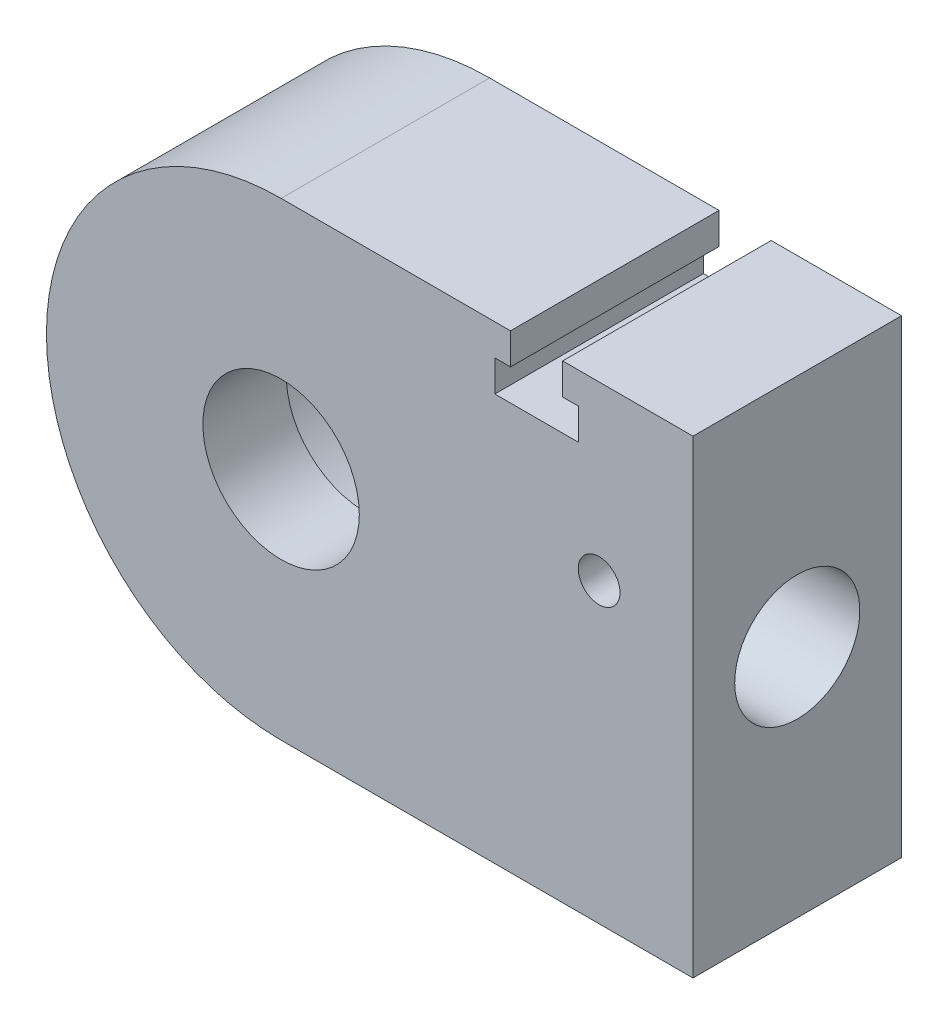
ISO-10303-21;
HEADER;
FILE_DESCRIPTION(('STEP AP214'),'2;1');
FILE_NAME('part.step','',(''),(''),'','','');
FILE_SCHEMA(('AUTOMOTIVE_DESIGN { 1 0 10303 214 1 1 1 1 }'));
ENDSEC;
DATA;
#1=APPLICATION_CONTEXT('core data for automotive mechanical design processes');
#2=APPLICATION_PROTOCOL_DEFINITION('international standard','automotive_design',2000,#1);
#3=PRODUCT_CONTEXT('',#1,'mechanical');
#4=PRODUCT('Part','Part','',(#3));
#5=PRODUCT_RELATED_PRODUCT_CATEGORY('part','',(#4));
#6=PRODUCT_DEFINITION_FORMATION('','',#4);
#7=PRODUCT_DEFINITION_CONTEXT('part definition',#1,'design');
#8=PRODUCT_DEFINITION('design','',#6,#7);
#9=PRODUCT_DEFINITION_SHAPE('','',#8);
#10=(LENGTH_UNIT() NAMED_UNIT(*) SI_UNIT(.MILLI.,.METRE.));
#11=(NAMED_UNIT(*) PLANE_ANGLE_UNIT() SI_UNIT($,.RADIAN.));
#12=(NAMED_UNIT(*) SI_UNIT($,.STERADIAN.) SOLID_ANGLE_UNIT());
#13=UNCERTAINTY_MEASURE_WITH_UNIT(LENGTH_MEASURE(1.E-05),#10,'distance_accuracy_value','');
#14=(GEOMETRIC_REPRESENTATION_CONTEXT(3) GLOBAL_UNCERTAINTY_ASSIGNED_CONTEXT((#13)) GLOBAL_UNIT_ASSIGNED_CONTEXT((#10,
#11,#12)) REPRESENTATION_CONTEXT('',''));
#15=CARTESIAN_POINT('',(0.,0.,0.));
#16=DIRECTION('',(0.,0.,1.));
#17=DIRECTION('',(1.,0.,0.));
#18=AXIS2_PLACEMENT_3D('',#15,#16,#17);
#19=CARTESIAN_POINT('',(-634.508066615171,-2.49999999999969,10.));
#20=DIRECTION('',(0.,0.,1.));
#21=DIRECTION('',(1.,0.,0.));
#22=AXIS2_PLACEMENT_3D('',#19,#20,#21);
#23=PLANE('',#22);
#24=CARTESIAN_POINT('',(-604.008671928237,3.50000000000032,10.));
#25=DIRECTION('',(0.,0.,1.));
#26=DIRECTION('',(1.,0.,0.));
#27=AXIS2_PLACEMENT_3D('',#24,#25,#26);
#28=CIRCLE('',#27,2.);
#29=CARTESIAN_POINT('',(-602.008671928237,3.50000000000032,10.));
#30=VERTEX_POINT('',#29);
#31=EDGE_CURVE('E247',#30,#30,#28,.T.);
#32=ORIENTED_EDGE('',*,*,#31,.F.);
#33=EDGE_LOOP('',(#32));
#34=FACE_BOUND('',#33,.T.);
#35=CARTESIAN_POINT('',(-634.508066615171,-2.49999999999969,10.));
#36=DIRECTION('',(0.,0.,1.));
#37=DIRECTION('',(1.,0.,0.));
#38=AXIS2_PLACEMENT_3D('',#35,#36,#37);
#39=CIRCLE('',#38,7.49999999999996);
#40=CARTESIAN_POINT('',(-627.008066615171,-2.49999999999969,10.));
#41=VERTEX_POINT('',#40);
#42=EDGE_CURVE('E184',#41,#41,#39,.T.);
#43=ORIENTED_EDGE('',*,*,#42,.F.);
#44=EDGE_LOOP('',(#43));
#45=FACE_BOUND('',#44,.T.);
#46=DIRECTION('',(1.,0.,0.));
#47=VECTOR('',#46,1.);
#48=CARTESIAN_POINT('',(-634.508066615171,19.9999999999999,10.));
#49=LINE('',#48,#47);
#50=CARTESIAN_POINT('',(-607.508671928237,19.9999999999999,10.));
#51=VERTEX_POINT('',#50);
#52=CARTESIAN_POINT('',(-595.008671928237,19.9999999999999,10.));
#53=VERTEX_POINT('',#52);
#54=EDGE_CURVE('E109',#51,#53,#49,.T.);
#55=ORIENTED_EDGE('',*,*,#54,.F.);
#56=DIRECTION('',(0.,-1.,0.));
#57=VECTOR('',#56,1.);
#58=CARTESIAN_POINT('',(-607.508671928237,0.,10.));
#59=LINE('',#58,#57);
#60=CARTESIAN_POINT('',(-607.508671928237,16.9999999999999,10.));
#61=VERTEX_POINT('',#60);
#62=EDGE_CURVE('E156',#51,#61,#59,.T.);
#63=ORIENTED_EDGE('',*,*,#62,.T.);
#64=DIRECTION('',(1.,0.,0.));
#65=VECTOR('',#64,1.);
#66=CARTESIAN_POINT('',(0.,16.9999999999999,10.));
#67=LINE('',#66,#65);
#68=CARTESIAN_POINT('',(-606.008671928237,16.9999999999999,10.));
#69=VERTEX_POINT('',#68);
#70=EDGE_CURVE('E524',#61,#69,#67,.T.);
#71=ORIENTED_EDGE('',*,*,#70,.T.);
#72=DIRECTION('',(0.,-1.,0.));
#73=VECTOR('',#72,1.);
#74=CARTESIAN_POINT('',(-606.008671928237,0.,10.));
#75=LINE('',#74,#73);
#76=CARTESIAN_POINT('',(-606.008671928237,13.9999999999999,10.));
#77=VERTEX_POINT('',#76);
#78=EDGE_CURVE('E551',#69,#77,#75,.T.);
#79=ORIENTED_EDGE('',*,*,#78,.T.);
#80=DIRECTION('',(1.,0.,0.));
#81=VECTOR('',#80,1.);
#82=CARTESIAN_POINT('',(0.,13.9999999999999,10.));
#83=LINE('',#82,#81);
#84=CARTESIAN_POINT('',(-614.008671928237,13.9999999999999,10.));
#85=VERTEX_POINT('',#84);
#86=EDGE_CURVE('E549',#85,#77,#83,.T.);
#87=ORIENTED_EDGE('',*,*,#86,.F.);
#88=DIRECTION('',(0.,-1.,0.));
#89=VECTOR('',#88,1.);
#90=CARTESIAN_POINT('',(-614.008671928237,0.,10.));
#91=LINE('',#90,#89);
#92=CARTESIAN_POINT('',(-614.008671928237,16.9999999999999,10.));
#93=VERTEX_POINT('',#92);
#94=EDGE_CURVE('E543',#93,#85,#91,.T.);
#95=ORIENTED_EDGE('',*,*,#94,.F.);
#96=DIRECTION('',(-1.,0.,0.));
#97=VECTOR('',#96,1.);
#98=CARTESIAN_POINT('',(0.,16.9999999999999,10.));
#99=LINE('',#98,#97);
#100=CARTESIAN_POINT('',(-612.508671928237,16.9999999999999,10.));
#101=VERTEX_POINT('',#100);
#102=EDGE_CURVE('E545',#101,#93,#99,.T.);
#103=ORIENTED_EDGE('',*,*,#102,.F.);
#104=DIRECTION('',(0.,-1.,0.));
#105=VECTOR('',#104,1.);
#106=CARTESIAN_POINT('',(-612.508671928237,0.,10.));
#107=LINE('',#106,#105);
#108=CARTESIAN_POINT('',(-612.508671928237,19.9999999999999,10.));
#109=VERTEX_POINT('',#108);
#110=EDGE_CURVE('E165',#109,#101,#107,.T.);
#111=ORIENTED_EDGE('',*,*,#110,.F.);
#112=CARTESIAN_POINT('',(-634.508066615171,19.9999999999999,10.));
#113=VERTEX_POINT('',#112);
#114=EDGE_CURVE('E177',#113,#109,#49,.T.);
#115=ORIENTED_EDGE('',*,*,#114,.F.);
#116=CARTESIAN_POINT('',(-634.508066615171,-2.49999999999969,10.));
#117=DIRECTION('',(0.,0.,1.));
#118=DIRECTION('',(1.,0.,0.));
#119=AXIS2_PLACEMENT_3D('',#116,#117,#118);
#120=CIRCLE('',#119,22.4999999999996);
#121=CARTESIAN_POINT('',(-634.508066615171,-24.9999999999993,10.));
#122=VERTEX_POINT('',#121);
#123=EDGE_CURVE('E190',#113,#122,#120,.T.);
#124=ORIENTED_EDGE('',*,*,#123,.T.);
#125=DIRECTION('',(-1.,0.,0.));
#126=VECTOR('',#125,1.);
#127=CARTESIAN_POINT('',(-595.008671928237,-24.9999999999993,10.));
#128=LINE('',#127,#126);
#129=CARTESIAN_POINT('',(-595.008671928237,-24.9999999999993,10.));
#130=VERTEX_POINT('',#129);
#131=EDGE_CURVE('E187',#130,#122,#128,.T.);
#132=ORIENTED_EDGE('',*,*,#131,.F.);
#133=DIRECTION('',(0.,-1.,0.));
#134=VECTOR('',#133,1.);
#135=CARTESIAN_POINT('',(-595.008671928237,19.9999999999999,10.));
#136=LINE('',#135,#134);
#137=EDGE_CURVE('E176',#53,#130,#136,.T.);
#138=ORIENTED_EDGE('',*,*,#137,.F.);
#139=EDGE_LOOP('',(#55,#63,#71,#79,#87,#95,#103,#111,#115,#124,#132,#138));
#140=FACE_BOUND('',#139,.T.);
#141=ADVANCED_FACE('F53',(#34,#45,#140),#23,.T.);
#142=CARTESIAN_POINT('',(-634.508066615171,-2.49999999999969,-10.));
#143=DIRECTION('',(0.,0.,1.));
#144=DIRECTION('',(1.,0.,0.));
#145=AXIS2_PLACEMENT_3D('',#142,#143,#144);
#146=PLANE('',#145);
#147=CARTESIAN_POINT('',(-634.508066615171,-2.49999999999969,-10.));
#148=DIRECTION('',(0.,0.,1.));
#149=DIRECTION('',(1.,0.,0.));
#150=AXIS2_PLACEMENT_3D('',#147,#148,#149);
#151=CIRCLE('',#150,14.);
#152=CARTESIAN_POINT('',(-620.508066615171,-2.49999999999969,-10.));
#153=VERTEX_POINT('',#152);
#154=EDGE_CURVE('E214',#153,#153,#151,.T.);
#155=ORIENTED_EDGE('',*,*,#154,.T.);
#156=EDGE_LOOP('',(#155));
#157=FACE_BOUND('',#156,.T.);
#158=CARTESIAN_POINT('',(-604.008671928237,3.50000000000032,-10.));
#159=DIRECTION('',(0.,0.,1.));
#160=DIRECTION('',(1.,0.,0.));
#161=AXIS2_PLACEMENT_3D('',#158,#159,#160);
#162=CIRCLE('',#161,2.);
#163=CARTESIAN_POINT('',(-602.008671928237,3.50000000000032,-10.));
#164=VERTEX_POINT('',#163);
#165=EDGE_CURVE('E249',#164,#164,#162,.T.);
#166=ORIENTED_EDGE('',*,*,#165,.T.);
#167=EDGE_LOOP('',(#166));
#168=FACE_BOUND('',#167,.T.);
#169=DIRECTION('',(0.,-1.,0.));
#170=VECTOR('',#169,1.);
#171=CARTESIAN_POINT('',(-607.508671928237,0.,-10.));
#172=LINE('',#171,#170);
#173=CARTESIAN_POINT('',(-607.508671928237,19.9999999999999,-10.));
#174=VERTEX_POINT('',#173);
#175=CARTESIAN_POINT('',(-607.508671928237,16.9999999999999,-10.));
#176=VERTEX_POINT('',#175);
#177=EDGE_CURVE('E231',#174,#176,#172,.T.);
#178=ORIENTED_EDGE('',*,*,#177,.F.);
#179=DIRECTION('',(1.,0.,0.));
#180=VECTOR('',#179,1.);
#181=CARTESIAN_POINT('',(-634.508066615171,19.9999999999999,-10.));
#182=LINE('',#181,#180);
#183=CARTESIAN_POINT('',(-595.008671928237,19.9999999999999,-10.));
#184=VERTEX_POINT('',#183);
#185=EDGE_CURVE('E169',#174,#184,#182,.T.);
#186=ORIENTED_EDGE('',*,*,#185,.T.);
#187=DIRECTION('',(0.,-1.,0.));
#188=VECTOR('',#187,1.);
#189=CARTESIAN_POINT('',(-595.008671928237,19.9999999999999,-10.));
#190=LINE('',#189,#188);
#191=CARTESIAN_POINT('',(-595.008671928237,-24.9999999999993,-10.));
#192=VERTEX_POINT('',#191);
#193=EDGE_CURVE('E196',#184,#192,#190,.T.);
#194=ORIENTED_EDGE('',*,*,#193,.T.);
#195=DIRECTION('',(-1.,0.,0.));
#196=VECTOR('',#195,1.);
#197=CARTESIAN_POINT('',(-595.008671928237,-24.9999999999993,-10.));
#198=LINE('',#197,#196);
#199=CARTESIAN_POINT('',(-634.508066615171,-24.9999999999993,-10.));
#200=VERTEX_POINT('',#199);
#201=EDGE_CURVE('E180',#192,#200,#198,.T.);
#202=ORIENTED_EDGE('',*,*,#201,.T.);
#203=CARTESIAN_POINT('',(-634.508066615171,-2.49999999999969,-10.));
#204=DIRECTION('',(0.,0.,1.));
#205=DIRECTION('',(1.,0.,0.));
#206=AXIS2_PLACEMENT_3D('',#203,#204,#205);
#207=CIRCLE('',#206,22.4999999999996);
#208=CARTESIAN_POINT('',(-634.508066615171,19.9999999999999,-10.));
#209=VERTEX_POINT('',#208);
#210=EDGE_CURVE('E178',#209,#200,#207,.T.);
#211=ORIENTED_EDGE('',*,*,#210,.F.);
#212=CARTESIAN_POINT('',(-612.508671928237,19.9999999999999,-10.));
#213=VERTEX_POINT('',#212);
#214=EDGE_CURVE('E193',#209,#213,#182,.T.);
#215=ORIENTED_EDGE('',*,*,#214,.T.);
#216=DIRECTION('',(0.,-1.,0.));
#217=VECTOR('',#216,1.);
#218=CARTESIAN_POINT('',(-612.508671928237,0.,-10.));
#219=LINE('',#218,#217);
#220=CARTESIAN_POINT('',(-612.508671928237,16.9999999999999,-10.));
#221=VERTEX_POINT('',#220);
#222=EDGE_CURVE('E75',#213,#221,#219,.T.);
#223=ORIENTED_EDGE('',*,*,#222,.T.);
#224=DIRECTION('',(-1.,0.,0.));
#225=VECTOR('',#224,1.);
#226=CARTESIAN_POINT('',(0.,16.9999999999999,-10.));
#227=LINE('',#226,#225);
#228=CARTESIAN_POINT('',(-614.008671928237,16.9999999999999,-10.));
#229=VERTEX_POINT('',#228);
#230=EDGE_CURVE('E518',#221,#229,#227,.T.);
#231=ORIENTED_EDGE('',*,*,#230,.T.);
#232=DIRECTION('',(0.,-1.,0.));
#233=VECTOR('',#232,1.);
#234=CARTESIAN_POINT('',(-614.008671928237,0.,-10.));
#235=LINE('',#234,#233);
#236=CARTESIAN_POINT('',(-614.008671928237,13.9999999999999,-10.));
#237=VERTEX_POINT('',#236);
#238=EDGE_CURVE('E521',#229,#237,#235,.T.);
#239=ORIENTED_EDGE('',*,*,#238,.T.);
#240=DIRECTION('',(1.,0.,0.));
#241=VECTOR('',#240,1.);
#242=CARTESIAN_POINT('',(0.,13.9999999999999,-10.));
#243=LINE('',#242,#241);
#244=CARTESIAN_POINT('',(-606.008671928237,13.9999999999999,-10.));
#245=VERTEX_POINT('',#244);
#246=EDGE_CURVE('E529',#237,#245,#243,.T.);
#247=ORIENTED_EDGE('',*,*,#246,.T.);
#248=DIRECTION('',(0.,-1.,0.));
#249=VECTOR('',#248,1.);
#250=CARTESIAN_POINT('',(-606.008671928237,0.,-10.));
#251=LINE('',#250,#249);
#252=CARTESIAN_POINT('',(-606.008671928237,16.9999999999999,-10.));
#253=VERTEX_POINT('',#252);
#254=EDGE_CURVE('E532',#253,#245,#251,.T.);
#255=ORIENTED_EDGE('',*,*,#254,.F.);
#256=DIRECTION('',(1.,0.,0.));
#257=VECTOR('',#256,1.);
#258=CARTESIAN_POINT('',(0.,16.9999999999999,-10.));
#259=LINE('',#258,#257);
#260=EDGE_CURVE('E171',#176,#253,#259,.T.);
#261=ORIENTED_EDGE('',*,*,#260,.F.);
#262=EDGE_LOOP('',(#178,#186,#194,#202,#211,#215,#223,#231,#239,#247,#255,#261));
#263=FACE_BOUND('',#262,.T.);
#264=ADVANCED_FACE('F228',(#157,#168,#263),#146,.F.);
#265=CARTESIAN_POINT('',(-634.508066615171,19.9999999999999,10.));
#266=DIRECTION('',(0.,1.,0.));
#267=DIRECTION('',(0.,0.,1.));
#268=AXIS2_PLACEMENT_3D('',#265,#266,#267);
#269=PLANE('',#268);
#270=ORIENTED_EDGE('',*,*,#185,.F.);
#271=DIRECTION('',(0.,0.,1.));
#272=VECTOR('',#271,1.);
#273=CARTESIAN_POINT('',(-607.508671928237,19.9999999999999,-10.));
#274=LINE('',#273,#272);
#275=EDGE_CURVE('E158',#174,#51,#274,.T.);
#276=ORIENTED_EDGE('',*,*,#275,.T.);
#277=ORIENTED_EDGE('',*,*,#54,.T.);
#278=DIRECTION('',(0.,0.,-1.));
#279=VECTOR('',#278,1.);
#280=CARTESIAN_POINT('',(-595.008671928237,19.9999999999999,10.));
#281=LINE('',#280,#279);
#282=EDGE_CURVE('E192',#53,#184,#281,.T.);
#283=ORIENTED_EDGE('',*,*,#282,.T.);
#284=EDGE_LOOP('',(#270,#276,#277,#283));
#285=FACE_BOUND('',#284,.T.);
#286=ADVANCED_FACE('F168',(#285),#269,.T.);
#287=DIRECTION('',(0.,0.,1.));
#288=VECTOR('',#287,1.);
#289=CARTESIAN_POINT('',(-612.508671928237,19.9999999999999,-10.));
#290=LINE('',#289,#288);
#291=EDGE_CURVE('E170',#213,#109,#290,.T.);
#292=ORIENTED_EDGE('',*,*,#291,.F.);
#293=ORIENTED_EDGE('',*,*,#214,.F.);
#294=DIRECTION('',(0.,0.,-1.));
#295=VECTOR('',#294,1.);
#296=CARTESIAN_POINT('',(-634.508066615171,19.9999999999999,10.));
#297=LINE('',#296,#295);
#298=EDGE_CURVE('E12',#113,#209,#297,.T.);
#299=ORIENTED_EDGE('',*,*,#298,.F.);
#300=ORIENTED_EDGE('',*,*,#114,.T.);
#301=EDGE_LOOP('',(#292,#293,#299,#300));
#302=FACE_BOUND('',#301,.T.);
#303=ADVANCED_FACE('F55',(#302),#269,.T.);
#304=CARTESIAN_POINT('',(-634.508066615171,-2.49999999999969,10.));
#305=DIRECTION('',(0.,0.,-1.));
#306=DIRECTION('',(-1.,0.,0.));
#307=AXIS2_PLACEMENT_3D('',#304,#305,#306);
#308=CYLINDRICAL_SURFACE('',#307,22.4999999999996);
#309=ORIENTED_EDGE('',*,*,#210,.T.);
#310=DIRECTION('',(0.,0.,-1.));
#311=VECTOR('',#310,1.);
#312=CARTESIAN_POINT('',(-634.508066615171,-24.9999999999993,10.));
#313=LINE('',#312,#311);
#314=EDGE_CURVE('E67',#122,#200,#313,.T.);
#315=ORIENTED_EDGE('',*,*,#314,.F.);
#316=ORIENTED_EDGE('',*,*,#123,.F.);
#317=ORIENTED_EDGE('',*,*,#298,.T.);
#318=EDGE_LOOP('',(#309,#315,#316,#317));
#319=FACE_BOUND('',#318,.T.);
#320=ADVANCED_FACE('F274',(#319),#308,.T.);
#321=CARTESIAN_POINT('',(-595.008671928237,-24.9999999999993,10.));
#322=DIRECTION('',(0.,-1.,0.));
#323=DIRECTION('',(1.,0.,0.));
#324=AXIS2_PLACEMENT_3D('',#321,#322,#323);
#325=PLANE('',#324);
#326=ORIENTED_EDGE('',*,*,#201,.F.);
#327=DIRECTION('',(0.,0.,-1.));
#328=VECTOR('',#327,1.);
#329=CARTESIAN_POINT('',(-595.008671928237,-24.9999999999993,10.));
#330=LINE('',#329,#328);
#331=EDGE_CURVE('E202',#130,#192,#330,.T.);
#332=ORIENTED_EDGE('',*,*,#331,.F.);
#333=ORIENTED_EDGE('',*,*,#131,.T.);
#334=ORIENTED_EDGE('',*,*,#314,.T.);
#335=EDGE_LOOP('',(#326,#332,#333,#334));
#336=FACE_BOUND('',#335,.T.);
#337=ADVANCED_FACE('F236',(#336),#325,.T.);
#338=CARTESIAN_POINT('',(-595.008671928237,19.9999999999999,10.));
#339=DIRECTION('',(1.,0.,0.));
#340=DIRECTION('',(0.,0.,-1.));
#341=AXIS2_PLACEMENT_3D('',#338,#339,#340);
#342=PLANE('',#341);
#343=CARTESIAN_POINT('',(-595.008671928237,-2.49999999999969,0.));
#344=DIRECTION('',(-1.,0.,0.));
#345=DIRECTION('',(0.,0.,1.));
#346=AXIS2_PLACEMENT_3D('',#343,#344,#345);
#347=CIRCLE('',#346,6.00000000000001);
#348=CARTESIAN_POINT('',(-595.008671928237,-2.49999999999969,6.00000000000001));
#349=VERTEX_POINT('',#348);
#350=EDGE_CURVE('E206',#349,#349,#347,.T.);
#351=ORIENTED_EDGE('',*,*,#350,.T.);
#352=EDGE_LOOP('',(#351));
#353=FACE_BOUND('',#352,.T.);
#354=ORIENTED_EDGE('',*,*,#193,.F.);
#355=ORIENTED_EDGE('',*,*,#282,.F.);
#356=ORIENTED_EDGE('',*,*,#137,.T.);
#357=ORIENTED_EDGE('',*,*,#331,.T.);
#358=EDGE_LOOP('',(#354,#355,#356,#357));
#359=FACE_BOUND('',#358,.T.);
#360=ADVANCED_FACE('F233',(#353,#359),#342,.T.);
#361=CARTESIAN_POINT('',(-634.508066615171,-2.49999999999969,10.));
#362=DIRECTION('',(0.,0.,-1.));
#363=DIRECTION('',(-1.,0.,0.));
#364=AXIS2_PLACEMENT_3D('',#361,#362,#363);
#365=CYLINDRICAL_SURFACE('',#364,7.49999999999996);
#366=CARTESIAN_POINT('',(-634.508066615171,-2.49999999999969,2.));
#367=DIRECTION('',(0.,0.,1.));
#368=DIRECTION('',(1.,0.,0.));
#369=AXIS2_PLACEMENT_3D('',#366,#367,#368);
#370=CIRCLE('',#369,7.49999999999996);
#371=CARTESIAN_POINT('',(-627.008066615171,-2.49999999999969,2.));
#372=VERTEX_POINT('',#371);
#373=EDGE_CURVE('E204',#372,#372,#370,.T.);
#374=ORIENTED_EDGE('',*,*,#373,.F.);
#375=EDGE_LOOP('',(#374));
#376=FACE_BOUND('',#375,.T.);
#377=ORIENTED_EDGE('',*,*,#42,.T.);
#378=EDGE_LOOP('',(#377));
#379=FACE_BOUND('',#378,.T.);
#380=ADVANCED_FACE('F267',(#376,#379),#365,.F.);
#381=CARTESIAN_POINT('',(-612.008671928237,-2.49999999999969,0.));
#382=DIRECTION('',(-1.,0.,0.));
#383=DIRECTION('',(0.,0.,1.));
#384=AXIS2_PLACEMENT_3D('',#381,#382,#383);
#385=PLANE('',#384);
#386=CARTESIAN_POINT('',(-612.008671928237,-2.49999999999969,0.));
#387=DIRECTION('',(-1.,0.,0.));
#388=DIRECTION('',(0.,0.,1.));
#389=AXIS2_PLACEMENT_3D('',#386,#387,#388);
#390=CIRCLE('',#389,6.00000000000001);
#391=CARTESIAN_POINT('',(-612.008671928237,-2.49999999999969,6.00000000000001));
#392=VERTEX_POINT('',#391);
#393=EDGE_CURVE('E211',#392,#392,#390,.T.);
#394=ORIENTED_EDGE('',*,*,#393,.F.);
#395=EDGE_LOOP('',(#394));
#396=FACE_BOUND('',#395,.T.);
#397=ADVANCED_FACE('F262',(#396),#385,.F.);
#398=CARTESIAN_POINT('',(-666.113025571018,-2.49999999999969,0.));
#399=DIRECTION('',(-1.,0.,0.));
#400=DIRECTION('',(0.,0.,1.));
#401=AXIS2_PLACEMENT_3D('',#398,#399,#400);
#402=CYLINDRICAL_SURFACE('',#401,6.00000000000001);
#403=CARTESIAN_POINT('',(-602.008671928237,3.50000000000032,0.));
#404=CARTESIAN_POINT('',(-602.008674236148,3.50000034205196,0.168404625428711));
#405=CARTESIAN_POINT('',(-602.008634884061,3.49290641783626,0.336801575679913));
#406=CARTESIAN_POINT('',(-602.008934966189,3.46457415462165,0.672484489536321));
#407=CARTESIAN_POINT('',(-602.009274572881,3.44332937683819,0.83976991237384));
#408=CARTESIAN_POINT('',(-602.011677423404,3.38681157645678,1.17213591901359));
#409=CARTESIAN_POINT('',(-602.013742628198,3.35152261800779,1.33721377721103));
#410=CARTESIAN_POINT('',(-602.021814532794,3.26719702898689,1.66367838894613));
#411=CARTESIAN_POINT('',(-602.027819235826,3.21816737022652,1.82506696956701));
#412=CARTESIAN_POINT('',(-602.043491278391,3.12666990439746,2.086229448696));
#413=CARTESIAN_POINT('',(-602.051095513519,3.08807345216627,2.1874965512854));
#414=CARTESIAN_POINT('',(-602.070278185055,3.00560622509883,2.3874647843065));
#415=CARTESIAN_POINT('',(-602.081855597946,2.96173681049957,2.48616656854282));
#416=CARTESIAN_POINT('',(-602.110159132702,2.86913655005333,2.6802811784473));
#417=CARTESIAN_POINT('',(-602.12687485363,2.82041565801858,2.77570021908406));
#418=CARTESIAN_POINT('',(-602.166830902239,2.7185849237655,2.96272001071977));
#419=CARTESIAN_POINT('',(-602.190068567439,2.66547687876325,3.05432230235765));
#420=CARTESIAN_POINT('',(-602.254082752954,2.53653574067951,3.26392373056456));
#421=CARTESIAN_POINT('',(-602.298147268396,2.45921210733965,3.38005187229782));
#422=CARTESIAN_POINT('',(-602.404956617582,2.30118669948619,3.60096634426211));
#423=CARTESIAN_POINT('',(-602.467676910383,2.22048948191002,3.70576732951828));
#424=CARTESIAN_POINT('',(-602.597804798067,2.08003265069607,3.87718348797675));
#425=CARTESIAN_POINT('',(-602.660562275891,2.01985171257043,3.94695667488873));
#426=CARTESIAN_POINT('',(-602.799886920084,1.90406477652339,4.07574327922136));
#427=CARTESIAN_POINT('',(-602.876437148985,1.84845328794078,4.13476971685851));
#428=CARTESIAN_POINT('',(-603.029512500796,1.75415600420293,4.23154625592695));
#429=CARTESIAN_POINT('',(-603.104041770216,1.71418732201139,4.27119323806358));
#430=CARTESIAN_POINT('',(-603.261460548453,1.64281672107886,4.3404548874414));
#431=CARTESIAN_POINT('',(-603.344347919185,1.61141261901179,4.37007211198536));
#432=CARTESIAN_POINT('',(-603.516903354336,1.559298924713,4.41852692583143));
#433=CARTESIAN_POINT('',(-603.606601444924,1.53864026822178,4.43731321891362));
#434=CARTESIAN_POINT('',(-603.789626478347,1.50987709822598,4.46332542081476));
#435=CARTESIAN_POINT('',(-603.882952378762,1.50176900536101,4.470554625679));
#436=CARTESIAN_POINT('',(-604.061915945222,1.49887981805983,4.47313701185764));
#437=CARTESIAN_POINT('',(-604.147525251839,1.50301355568609,4.46945718498281));
#438=CARTESIAN_POINT('',(-604.316530718968,1.52200867225344,4.45237100575788));
#439=CARTESIAN_POINT('',(-604.399927347396,1.53686776404599,4.43896672711388));
#440=CARTESIAN_POINT('',(-604.561354494127,1.5761048664466,4.40296040445153));
#441=CARTESIAN_POINT('',(-604.639432978894,1.60037905634381,4.38045856867576));
#442=CARTESIAN_POINT('',(-604.789439309588,1.6569497734008,4.32680969530758));
#443=CARTESIAN_POINT('',(-604.861366189234,1.68924755779043,4.2956613027825));
#444=CARTESIAN_POINT('',(-605.00287318657,1.76265313431491,4.22287060458482));
#445=CARTESIAN_POINT('',(-605.071897119646,1.80423244248087,4.18062750615882));
#446=CARTESIAN_POINT('',(-605.200804007686,1.89222951541363,4.0880815486084));
#447=CARTESIAN_POINT('',(-605.260682029577,1.93864986876335,4.03777436969224));
#448=CARTESIAN_POINT('',(-605.398173230339,2.05740667360314,3.90402222723651));
#449=CARTESIAN_POINT('',(-605.47027121673,2.13137806614303,3.81635135690242));
#450=CARTESIAN_POINT('',(-605.596199054552,2.27963983092468,3.62896545254279));
#451=CARTESIAN_POINT('',(-605.649988704163,2.3539305469937,3.52922455714428));
#452=CARTESIAN_POINT('',(-605.730600274869,2.48064613221888,3.3469732540676));
#453=CARTESIAN_POINT('',(-605.760802209048,2.53386381364579,3.26645391073398));
#454=CARTESIAN_POINT('',(-605.813991856031,2.63732563875096,3.10119126774797));
#455=CARTESIAN_POINT('',(-605.836975885881,2.68756825381876,3.0164458371953));
#456=CARTESIAN_POINT('',(-605.877012598935,2.78442045653861,2.84337092651659));
#457=CARTESIAN_POINT('',(-605.894054644461,2.83102341373796,2.75503533143639));
#458=CARTESIAN_POINT('',(-605.923311738639,2.92004552488898,2.57549153579485));
#459=CARTESIAN_POINT('',(-605.935525244181,2.96246333810336,2.48428242695135));
#460=CARTESIAN_POINT('',(-605.961634582917,3.06412814906897,2.25039079946921));
#461=CARTESIAN_POINT('',(-605.972978472287,3.12034745596764,2.10609945490037));
#462=CARTESIAN_POINT('',(-605.989855618658,3.22154403649079,1.81327516403384));
#463=CARTESIAN_POINT('',(-605.99538598841,3.26651571560791,1.66474014772081));
#464=CARTESIAN_POINT('',(-606.003032866055,3.3448432362811,1.36450782768776));
#465=CARTESIAN_POINT('',(-606.00514823582,3.37819520239728,1.21280948677112));
#466=CARTESIAN_POINT('',(-606.007738813103,3.43303351284988,0.907302829965303));
#467=CARTESIAN_POINT('',(-606.008214291766,3.45452181826753,0.753494867110305));
#468=CARTESIAN_POINT('',(-606.008686416362,3.48593582849968,0.440443638946741));
#469=CARTESIAN_POINT('',(-606.008669593243,3.49552878573337,0.281166872207315));
#470=CARTESIAN_POINT('',(-606.00867350011,3.50200026833398,-0.0376579461337047));
#471=CARTESIAN_POINT('',(-606.008694233376,3.49887768318638,-0.1972060202136));
#472=CARTESIAN_POINT('',(-606.008593496566,3.47993249647332,-0.515610004230075));
#473=CARTESIAN_POINT('',(-606.008471968928,3.46410475498098,-0.674465607868736));
#474=CARTESIAN_POINT('',(-606.007188059013,3.4198444214691,-0.990392335951929));
#475=CARTESIAN_POINT('',(-606.006025824461,3.39141361870955,-1.14746371045858));
#476=CARTESIAN_POINT('',(-606.001394543621,3.32695737902951,-1.43715838336218));
#477=CARTESIAN_POINT('',(-605.9982685246,3.29253646524747,-1.5701457369672));
#478=CARTESIAN_POINT('',(-605.988605281306,3.21468368271699,-1.83336487209153));
#479=CARTESIAN_POINT('',(-605.982067607354,3.17125062656337,-1.96359628800491));
#480=CARTESIAN_POINT('',(-605.963766887694,3.07578104051984,-2.22021522961452));
#481=CARTESIAN_POINT('',(-605.952014673389,3.02376248397128,-2.34661014587314));
#482=CARTESIAN_POINT('',(-605.921057001779,2.91164229116666,-2.59473809040948));
#483=CARTESIAN_POINT('',(-605.901856325398,2.85154585597335,-2.71647405416012));
#484=CARTESIAN_POINT('',(-605.849614249601,2.7144361244143,-2.97214743785992));
#485=CARTESIAN_POINT('',(-605.814918612073,2.6362389643219,-3.10514520012175));
#486=CARTESIAN_POINT('',(-605.749237276406,2.51381489235724,-3.29657898764226));
#487=CARTESIAN_POINT('',(-605.725076095114,2.47216010779093,-3.35903592066634));
#488=CARTESIAN_POINT('',(-605.671565023641,2.38766466284798,-3.48083655579336));
#489=CARTESIAN_POINT('',(-605.642216346287,2.34482428163222,-3.54018098139911));
#490=CARTESIAN_POINT('',(-605.559553860564,2.23436041908273,-3.68759982779275));
#491=CARTESIAN_POINT('',(-605.502037069103,2.16632887120981,-3.77309454392911));
#492=CARTESIAN_POINT('',(-605.370814003929,2.0325858681495,-3.93274529762757));
#493=CARTESIAN_POINT('',(-605.297131169414,1.96687121217983,-4.00691749040432));
#494=CARTESIAN_POINT('',(-605.149551255573,1.85527495183691,-4.12758100919713));
#495=CARTESIAN_POINT('',(-605.078755409149,1.80808014857936,-4.17663323145694));
#496=CARTESIAN_POINT('',(-604.926914978014,1.72110472824782,-4.26451629597199));
#497=CARTESIAN_POINT('',(-604.845873640706,1.68132177176037,-4.30335036500091));
#498=CARTESIAN_POINT('',(-604.674552354635,1.61182722669048,-4.36980823207448));
#499=CARTESIAN_POINT('',(-604.584216275974,1.58218214031766,-4.39735823350905));
#500=CARTESIAN_POINT('',(-604.397464163014,1.5358009905454,-4.43996884353478));
#501=CARTESIAN_POINT('',(-604.301051031699,1.51905881328157,-4.45503536750292));
#502=CARTESIAN_POINT('',(-604.11663186736,1.50101088581757,-4.47124527189333));
#503=CARTESIAN_POINT('',(-604.028889945927,1.49818955577622,-4.47375608378581));
#504=CARTESIAN_POINT('',(-603.854122353322,1.50406670080161,-4.46849725808572));
#505=CARTESIAN_POINT('',(-603.767096452255,1.51276132058187,-4.46073106101027));
#506=CARTESIAN_POINT('',(-603.599725202493,1.54048918078783,-4.43562537221819));
#507=CARTESIAN_POINT('',(-603.519251675547,1.55910631646894,-4.41867075018887));
#508=CARTESIAN_POINT('',(-603.363401131273,1.60520910021181,-4.37587038660191));
#509=CARTESIAN_POINT('',(-603.288024291699,1.63269505739306,-4.35002433513472));
#510=CARTESIAN_POINT('',(-603.140405683857,1.69642396282845,-4.28859705205003));
#511=CARTESIAN_POINT('',(-603.068490792657,1.73302552186615,-4.25260618026164));
#512=CARTESIAN_POINT('',(-602.932975395135,1.81208848310944,-4.17241765665001));
#513=CARTESIAN_POINT('',(-602.869379131058,1.854552852656,-4.12821584508984));
#514=CARTESIAN_POINT('',(-602.72648249617,1.96152703693555,-4.01287879644451));
#515=CARTESIAN_POINT('',(-602.65148918749,2.02791782298826,-3.93814535100383));
#516=CARTESIAN_POINT('',(-602.518052422921,2.16316378503942,-3.77703572009092));
#517=CARTESIAN_POINT('',(-602.459639646674,2.23202326731422,-3.69063838254948));
#518=CARTESIAN_POINT('',(-602.371589240797,2.3494579160375,-3.53405410826193));
#519=CARTESIAN_POINT('',(-602.338463771392,2.39836374008227,-3.46601418262431));
#520=CARTESIAN_POINT('',(-602.27886397477,2.49453150383572,-3.32593867994963));
#521=CARTESIAN_POINT('',(-602.252392706762,2.54179267886074,-3.25390128362235));
#522=CARTESIAN_POINT('',(-602.205138203485,2.63400015082108,-3.10638489949484));
#523=CARTESIAN_POINT('',(-602.184365514079,2.67894203256226,-3.03089982840293));
#524=CARTESIAN_POINT('',(-602.147660825407,2.76592620510464,-2.8771224720851));
#525=CARTESIAN_POINT('',(-602.131730457237,2.80796751519418,-2.79882925086325));
#526=CARTESIAN_POINT('',(-602.095855192433,2.912052663984,-2.59410929461756));
#527=CARTESIAN_POINT('',(-602.078880042846,2.97167600296509,-2.4659240860795));
#528=CARTESIAN_POINT('',(-602.052031291406,3.08194022245965,-2.20500391405677));
#529=CARTESIAN_POINT('',(-602.042162084832,3.13257552899452,-2.07226618775742));
#530=CARTESIAN_POINT('',(-602.02721198071,3.22435796598545,-1.80330623329401));
#531=CARTESIAN_POINT('',(-602.022130927402,3.26550540505142,-1.66708411862608));
#532=CARTESIAN_POINT('',(-602.014911042899,3.3380139535551,-1.39205603675114));
#533=CARTESIAN_POINT('',(-602.012771177104,3.36937850124606,-1.25325099554418));
#534=CARTESIAN_POINT('',(-602.009576354232,3.43041399456594,-0.930063926946477));
#535=CARTESIAN_POINT('',(-602.009069064562,3.45649571537113,-0.744988530408802));
#536=CARTESIAN_POINT('',(-602.008615646996,3.49128622923232,-0.373271995357978));
#537=CARTESIAN_POINT('',(-602.008669370536,3.49999962092796,-0.186631284441848));
#538=CARTESIAN_POINT('',(-602.008671928237,3.50000000000032,0.));
#539=B_SPLINE_CURVE_WITH_KNOTS('',3,(#403,#404,#405,#406,#407,#408,#409,#410,#411,#412,#413,
#414,#415,#416,#417,#418,#419,#420,#421,#422,#423,#424,#425,#426,#427,#428,#429,#430,#431,#432,
#433,#434,#435,#436,#437,#438,#439,#440,#441,#442,#443,#444,#445,#446,#447,#448,#449,#450,#451,
#452,#453,#454,#455,#456,#457,#458,#459,#460,#461,#462,#463,#464,#465,#466,#467,#468,#469,#470,
#471,#472,#473,#474,#475,#476,#477,#478,#479,#480,#481,#482,#483,#484,#485,#486,#487,#488,#489,
#490,#491,#492,#493,#494,#495,#496,#497,#498,#499,#500,#501,#502,#503,#504,#505,#506,#507,#508,
#509,#510,#511,#512,#513,#514,#515,#516,#517,#518,#519,#520,#521,#522,#523,#524,#525,#526,#527,
#528,#529,#530,#531,#532,#533,#534,#535,#536,#537,#538),.UNSPECIFIED.,.T.,.F.,(4,2,2,2,2,2,2,2,
2,2,2,2,2,2,2,2,2,2,2,2,2,2,2,2,2,2,2,2,2,2,2,2,2,2,2,2,2,2,2,2,2,2,2,2,2,2,2,2,2,2,2,2,2,2,2,2,
2,2,2,2,2,2,2,2,2,2,2,4),(0.,0.50505235962759,1.0103346804202,1.51619198435084,2.02179308761278,
2.34751526391298,2.67315359507073,2.99813706361599,3.32298805527877,3.76057072668945,
4.19758030198899,4.53081193794174,4.86363712104112,5.14266651063176,5.42162470200779,
5.70189343406632,5.98208222009339,6.23819793290856,6.4942590459712,6.74757335360546,
7.00092737852652,7.27280723746336,7.54483322757185,7.94900689018078,8.3540624049501,
8.6570537211556,8.96019938923986,9.26388501250384,9.56766760962363,10.0327998683078,
10.4981630231276,10.9636812389476,11.4291224808387,11.9073094972678,12.3855382771545,
12.863960624162,13.3423150711629,13.7541919099508,14.166123050543,14.5772025233912,
14.9880185732253,15.460974346887,15.6973671228902,15.9337047035808,16.3027542688317,
16.6712722430328,16.9647204420619,17.2580758620524,17.5533202874425,17.8484247292002,
18.1105604225562,18.3726083808309,18.6244442226782,18.8762888431189,19.1402880603933,
19.4044213886436,19.7772484910124,20.1507610195077,20.4207149371799,20.6907927376836,
20.9613670267493,21.2320323557901,21.6585405187635,22.0853122660271,22.5120701298149,
22.9386778376601,23.4985409486944,24.0582558041963),.UNSPECIFIED.);
#540=CARTESIAN_POINT('',(-602.008671928237,3.50000000000032,0.));
#541=VERTEX_POINT('',#540);
#542=EDGE_CURVE('E57',#541,#541,#539,.T.);
#543=ORIENTED_EDGE('',*,*,#542,.F.);
#544=EDGE_LOOP('',(#543));
#545=FACE_BOUND('',#544,.T.);
#546=ORIENTED_EDGE('',*,*,#393,.T.);
#547=EDGE_LOOP('',(#546));
#548=FACE_BOUND('',#547,.T.);
#549=ORIENTED_EDGE('',*,*,#350,.F.);
#550=EDGE_LOOP('',(#549));
#551=FACE_BOUND('',#550,.T.);
#552=ADVANCED_FACE('F259',(#545,#548,#551),#402,.F.);
#553=CARTESIAN_POINT('',(-634.508066615171,-2.49999999999969,2.));
#554=DIRECTION('',(0.,0.,-1.));
#555=DIRECTION('',(-1.,0.,0.));
#556=AXIS2_PLACEMENT_3D('',#553,#554,#555);
#557=CYLINDRICAL_SURFACE('',#556,14.);
#558=CARTESIAN_POINT('',(-634.508066615171,-2.49999999999969,2.));
#559=DIRECTION('',(0.,0.,1.));
#560=DIRECTION('',(1.,0.,0.));
#561=AXIS2_PLACEMENT_3D('',#558,#559,#560);
#562=CIRCLE('',#561,14.);
#563=CARTESIAN_POINT('',(-620.508066615171,-2.49999999999969,2.));
#564=VERTEX_POINT('',#563);
#565=EDGE_CURVE('E207',#564,#564,#562,.T.);
#566=ORIENTED_EDGE('',*,*,#565,.T.);
#567=EDGE_LOOP('',(#566));
#568=FACE_BOUND('',#567,.T.);
#569=ORIENTED_EDGE('',*,*,#154,.F.);
#570=EDGE_LOOP('',(#569));
#571=FACE_BOUND('',#570,.T.);
#572=ADVANCED_FACE('F261',(#568,#571),#557,.F.);
#573=CARTESIAN_POINT('',(-634.508066615171,-2.49999999999969,2.));
#574=DIRECTION('',(0.,0.,1.));
#575=DIRECTION('',(1.,0.,0.));
#576=AXIS2_PLACEMENT_3D('',#573,#574,#575);
#577=PLANE('',#576);
#578=ORIENTED_EDGE('',*,*,#373,.T.);
#579=EDGE_LOOP('',(#578));
#580=FACE_BOUND('',#579,.T.);
#581=ORIENTED_EDGE('',*,*,#565,.F.);
#582=EDGE_LOOP('',(#581));
#583=FACE_BOUND('',#582,.T.);
#584=ADVANCED_FACE('F312',(#580,#583),#577,.F.);
#585=CARTESIAN_POINT('',(-604.008671928237,3.50000000000032,-10.));
#586=DIRECTION('',(0.,0.,1.));
#587=DIRECTION('',(1.,0.,0.));
#588=AXIS2_PLACEMENT_3D('',#585,#586,#587);
#589=CYLINDRICAL_SURFACE('',#588,2.);
#590=ORIENTED_EDGE('',*,*,#542,.T.);
#591=EDGE_LOOP('',(#590));
#592=FACE_BOUND('',#591,.T.);
#593=ORIENTED_EDGE('',*,*,#165,.F.);
#594=EDGE_LOOP('',(#593));
#595=FACE_BOUND('',#594,.T.);
#596=ORIENTED_EDGE('',*,*,#31,.T.);
#597=EDGE_LOOP('',(#596));
#598=FACE_BOUND('',#597,.T.);
#599=ADVANCED_FACE('F256',(#592,#595,#598),#589,.F.);
#600=CARTESIAN_POINT('',(-607.508671928237,0.,-10.));
#601=DIRECTION('',(-1.,0.,0.));
#602=DIRECTION('',(0.,0.,1.));
#603=AXIS2_PLACEMENT_3D('',#600,#601,#602);
#604=PLANE('',#603);
#605=ORIENTED_EDGE('',*,*,#275,.F.);
#606=ORIENTED_EDGE('',*,*,#177,.T.);
#607=DIRECTION('',(0.,0.,1.));
#608=VECTOR('',#607,1.);
#609=CARTESIAN_POINT('',(-607.508671928237,16.9999999999999,-10.));
#610=LINE('',#609,#608);
#611=EDGE_CURVE('E161',#176,#61,#610,.T.);
#612=ORIENTED_EDGE('',*,*,#611,.T.);
#613=ORIENTED_EDGE('',*,*,#62,.F.);
#614=EDGE_LOOP('',(#605,#606,#612,#613));
#615=FACE_BOUND('',#614,.T.);
#616=ADVANCED_FACE('F157',(#615),#604,.T.);
#617=CARTESIAN_POINT('',(0.,16.9999999999999,-10.));
#618=DIRECTION('',(0.,-1.,0.));
#619=DIRECTION('',(0.,0.,-1.));
#620=AXIS2_PLACEMENT_3D('',#617,#618,#619);
#621=PLANE('',#620);
#622=ORIENTED_EDGE('',*,*,#611,.F.);
#623=ORIENTED_EDGE('',*,*,#260,.T.);
#624=DIRECTION('',(0.,0.,1.));
#625=VECTOR('',#624,1.);
#626=CARTESIAN_POINT('',(-606.008671928237,16.9999999999999,-10.));
#627=LINE('',#626,#625);
#628=EDGE_CURVE('E536',#253,#69,#627,.T.);
#629=ORIENTED_EDGE('',*,*,#628,.T.);
#630=ORIENTED_EDGE('',*,*,#70,.F.);
#631=EDGE_LOOP('',(#622,#623,#629,#630));
#632=FACE_BOUND('',#631,.T.);
#633=ADVANCED_FACE('F369',(#632),#621,.T.);
#634=CARTESIAN_POINT('',(-606.008671928237,0.,-10.));
#635=DIRECTION('',(-1.,0.,0.));
#636=DIRECTION('',(0.,0.,1.));
#637=AXIS2_PLACEMENT_3D('',#634,#635,#636);
#638=PLANE('',#637);
#639=ORIENTED_EDGE('',*,*,#628,.F.);
#640=ORIENTED_EDGE('',*,*,#254,.T.);
#641=DIRECTION('',(0.,0.,1.));
#642=VECTOR('',#641,1.);
#643=CARTESIAN_POINT('',(-606.008671928237,13.9999999999999,-10.));
#644=LINE('',#643,#642);
#645=EDGE_CURVE('E538',#245,#77,#644,.T.);
#646=ORIENTED_EDGE('',*,*,#645,.T.);
#647=ORIENTED_EDGE('',*,*,#78,.F.);
#648=EDGE_LOOP('',(#639,#640,#646,#647));
#649=FACE_BOUND('',#648,.T.);
#650=ADVANCED_FACE('F358',(#649),#638,.T.);
#651=CARTESIAN_POINT('',(0.,13.9999999999999,-10.));
#652=DIRECTION('',(0.,-1.,0.));
#653=DIRECTION('',(0.,0.,-1.));
#654=AXIS2_PLACEMENT_3D('',#651,#652,#653);
#655=PLANE('',#654);
#656=ORIENTED_EDGE('',*,*,#645,.F.);
#657=ORIENTED_EDGE('',*,*,#246,.F.);
#658=DIRECTION('',(0.,0.,1.));
#659=VECTOR('',#658,1.);
#660=CARTESIAN_POINT('',(-614.008671928237,13.9999999999999,-10.));
#661=LINE('',#660,#659);
#662=EDGE_CURVE('E540',#237,#85,#661,.T.);
#663=ORIENTED_EDGE('',*,*,#662,.T.);
#664=ORIENTED_EDGE('',*,*,#86,.T.);
#665=EDGE_LOOP('',(#656,#657,#663,#664));
#666=FACE_BOUND('',#665,.T.);
#667=ADVANCED_FACE('F352',(#666),#655,.F.);
#668=CARTESIAN_POINT('',(-614.008671928237,0.,-10.));
#669=DIRECTION('',(-1.,0.,0.));
#670=DIRECTION('',(0.,0.,1.));
#671=AXIS2_PLACEMENT_3D('',#668,#669,#670);
#672=PLANE('',#671);
#673=ORIENTED_EDGE('',*,*,#662,.F.);
#674=ORIENTED_EDGE('',*,*,#238,.F.);
#675=DIRECTION('',(0.,0.,1.));
#676=VECTOR('',#675,1.);
#677=CARTESIAN_POINT('',(-614.008671928237,16.9999999999999,-10.));
#678=LINE('',#677,#676);
#679=EDGE_CURVE('E243',#229,#93,#678,.T.);
#680=ORIENTED_EDGE('',*,*,#679,.T.);
#681=ORIENTED_EDGE('',*,*,#94,.T.);
#682=EDGE_LOOP('',(#673,#674,#680,#681));
#683=FACE_BOUND('',#682,.T.);
#684=ADVANCED_FACE('F357',(#683),#672,.F.);
#685=CARTESIAN_POINT('',(0.,16.9999999999999,-10.));
#686=DIRECTION('',(0.,1.,0.));
#687=DIRECTION('',(0.,0.,1.));
#688=AXIS2_PLACEMENT_3D('',#685,#686,#687);
#689=PLANE('',#688);
#690=ORIENTED_EDGE('',*,*,#679,.F.);
#691=ORIENTED_EDGE('',*,*,#230,.F.);
#692=DIRECTION('',(0.,0.,1.));
#693=VECTOR('',#692,1.);
#694=CARTESIAN_POINT('',(-612.508671928237,16.9999999999999,-10.));
#695=LINE('',#694,#693);
#696=EDGE_CURVE('E241',#221,#101,#695,.T.);
#697=ORIENTED_EDGE('',*,*,#696,.T.);
#698=ORIENTED_EDGE('',*,*,#102,.T.);
#699=EDGE_LOOP('',(#690,#691,#697,#698));
#700=FACE_BOUND('',#699,.T.);
#701=ADVANCED_FACE('F410',(#700),#689,.F.);
#702=CARTESIAN_POINT('',(-612.508671928237,0.,-10.));
#703=DIRECTION('',(-1.,0.,0.));
#704=DIRECTION('',(0.,0.,1.));
#705=AXIS2_PLACEMENT_3D('',#702,#703,#704);
#706=PLANE('',#705);
#707=ORIENTED_EDGE('',*,*,#696,.F.);
#708=ORIENTED_EDGE('',*,*,#222,.F.);
#709=ORIENTED_EDGE('',*,*,#291,.T.);
#710=ORIENTED_EDGE('',*,*,#110,.T.);
#711=EDGE_LOOP('',(#707,#708,#709,#710));
#712=FACE_BOUND('',#711,.T.);
#713=ADVANCED_FACE('F422',(#712),#706,.F.);
#714=CLOSED_SHELL('',(#141,#264,#286,#303,#320,#337,#360,#380,#397,#552,#572,#584,#599,#616,
#633,#650,#667,#684,#701,#713));
#715=MANIFOLD_SOLID_BREP('B2',#714);
#716=ADVANCED_BREP_SHAPE_REPRESENTATION('',(#18,#715),#14);
#717=SHAPE_DEFINITION_REPRESENTATION(#9,#716);
ENDSEC;
END-ISO-10303-21;
